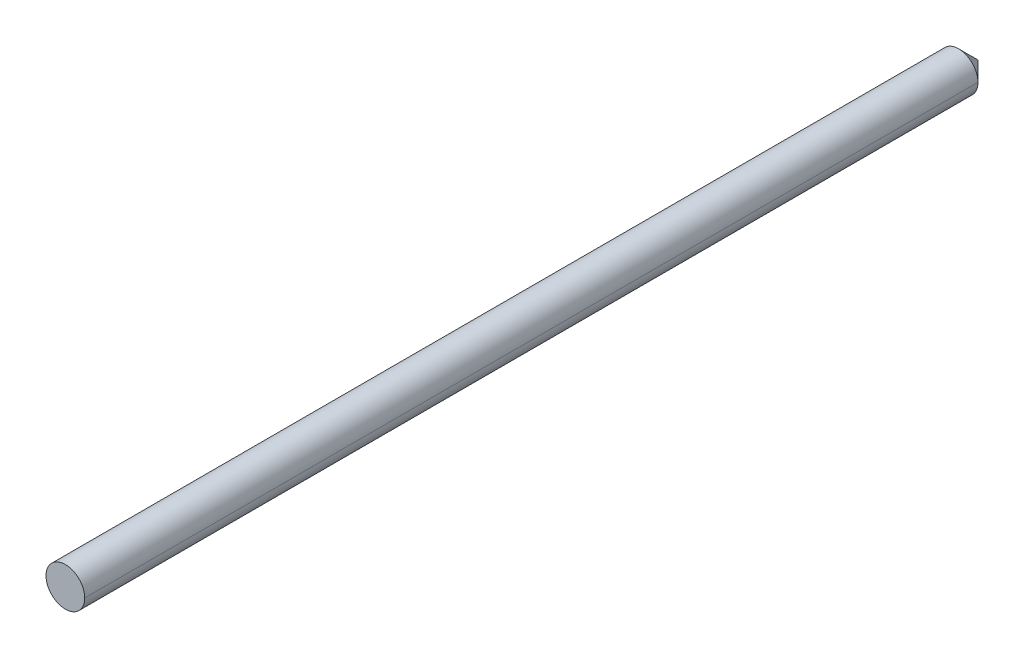
ISO-10303-21;
HEADER;
FILE_DESCRIPTION(('STEP AP214'),'2;1');
FILE_NAME('part.step','',(''),(''),'','','');
FILE_SCHEMA(('AUTOMOTIVE_DESIGN { 1 0 10303 214 1 1 1 1 }'));
ENDSEC;
DATA;
#1=APPLICATION_CONTEXT('core data for automotive mechanical design processes');
#2=APPLICATION_PROTOCOL_DEFINITION('international standard','automotive_design',2000,#1);
#3=PRODUCT_CONTEXT('',#1,'mechanical');
#4=PRODUCT('Part','Part','',(#3));
#5=PRODUCT_RELATED_PRODUCT_CATEGORY('part','',(#4));
#6=PRODUCT_DEFINITION_FORMATION('','',#4);
#7=PRODUCT_DEFINITION_CONTEXT('part definition',#1,'design');
#8=PRODUCT_DEFINITION('design','',#6,#7);
#9=PRODUCT_DEFINITION_SHAPE('','',#8);
#10=(LENGTH_UNIT() NAMED_UNIT(*) SI_UNIT(.MILLI.,.METRE.));
#11=(NAMED_UNIT(*) PLANE_ANGLE_UNIT() SI_UNIT($,.RADIAN.));
#12=(NAMED_UNIT(*) SI_UNIT($,.STERADIAN.) SOLID_ANGLE_UNIT());
#13=UNCERTAINTY_MEASURE_WITH_UNIT(LENGTH_MEASURE(1.E-05),#10,'distance_accuracy_value','');
#14=(GEOMETRIC_REPRESENTATION_CONTEXT(3) GLOBAL_UNCERTAINTY_ASSIGNED_CONTEXT((#13)) GLOBAL_UNIT_ASSIGNED_CONTEXT((#10,
#11,#12)) REPRESENTATION_CONTEXT('',''));
#15=CARTESIAN_POINT('',(0.,0.,0.));
#16=DIRECTION('',(0.,0.,1.));
#17=DIRECTION('',(1.,0.,0.));
#18=AXIS2_PLACEMENT_3D('',#15,#16,#17);
#19=CARTESIAN_POINT('',(4.45,2.08,-23.295));
#20=DIRECTION('',(0.,0.,-1.));
#21=DIRECTION('',(1.,0.,0.));
#22=AXIS2_PLACEMENT_3D('',#19,#20,#21);
#23=CYLINDRICAL_SURFACE('',#22,0.96);
#24=DIRECTION('',(0.,0.,-1.));
#25=VECTOR('',#24,1.);
#26=CARTESIAN_POINT('',(5.41,2.08,-23.295));
#27=LINE('',#26,#25);
#28=CARTESIAN_POINT('',(5.41,2.08,-1.155));
#29=VERTEX_POINT('',#28);
#30=CARTESIAN_POINT('',(5.41,2.08,-45.435));
#31=VERTEX_POINT('',#30);
#32=EDGE_CURVE('E71',#29,#31,#27,.T.);
#33=ORIENTED_EDGE('',*,*,#32,.T.);
#34=CARTESIAN_POINT('',(4.45,2.08,-45.435));
#35=DIRECTION('',(0.,0.,-1.));
#36=DIRECTION('',(1.,0.,0.));
#37=AXIS2_PLACEMENT_3D('',#34,#35,#36);
#38=CIRCLE('',#37,0.96);
#39=CARTESIAN_POINT('',(3.49,2.08,-45.435));
#40=VERTEX_POINT('',#39);
#41=EDGE_CURVE('E25',#40,#31,#38,.T.);
#42=ORIENTED_EDGE('',*,*,#41,.F.);
#43=DIRECTION('',(0.,0.,1.));
#44=VECTOR('',#43,1.);
#45=CARTESIAN_POINT('',(3.49,2.08,-23.295));
#46=LINE('',#45,#44);
#47=CARTESIAN_POINT('',(3.49,2.08,-1.155));
#48=VERTEX_POINT('',#47);
#49=EDGE_CURVE('E72',#40,#48,#46,.T.);
#50=ORIENTED_EDGE('',*,*,#49,.T.);
#51=CARTESIAN_POINT('',(4.45,2.08,-1.155));
#52=DIRECTION('',(0.,0.,1.));
#53=DIRECTION('',(1.,0.,0.));
#54=AXIS2_PLACEMENT_3D('',#51,#52,#53);
#55=CIRCLE('',#54,0.96);
#56=EDGE_CURVE('E11',#29,#48,#55,.T.);
#57=ORIENTED_EDGE('',*,*,#56,.F.);
#58=EDGE_LOOP('',(#33,#42,#50,#57));
#59=FACE_BOUND('',#58,.T.);
#60=ADVANCED_FACE('F17',(#59),#23,.T.);
#61=CARTESIAN_POINT('',(4.45,2.08,-1.155));
#62=DIRECTION('',(0.,0.,-1.));
#63=DIRECTION('',(0.,-1.,0.));
#64=AXIS2_PLACEMENT_3D('',#61,#62,#63);
#65=PLANE('',#64);
#66=ORIENTED_EDGE('',*,*,#56,.T.);
#67=CARTESIAN_POINT('',(4.45,2.08,-1.155));
#68=DIRECTION('',(0.,0.,1.));
#69=DIRECTION('',(1.,0.,0.));
#70=AXIS2_PLACEMENT_3D('',#67,#68,#69);
#71=CIRCLE('',#70,0.96);
#72=EDGE_CURVE('E77',#48,#29,#71,.T.);
#73=ORIENTED_EDGE('',*,*,#72,.T.);
#74=EDGE_LOOP('',(#66,#73));
#75=FACE_BOUND('',#74,.T.);
#76=ADVANCED_FACE('F89',(#75),#65,.F.);
#77=CARTESIAN_POINT('',(4.45,2.08,-45.915));
#78=DIRECTION('',(0.,0.,1.));
#79=DIRECTION('',(1.,0.,0.));
#80=AXIS2_PLACEMENT_3D('',#77,#78,#79);
#81=CONICAL_SURFACE('',#80,0.48,0.785398163397448);
#82=DIRECTION('',(-0.707106781186548,0.,0.707106781186548));
#83=VECTOR('',#82,1.);
#84=CARTESIAN_POINT('',(3.97,2.08,-45.915));
#85=LINE('',#84,#83);
#86=CARTESIAN_POINT('',(4.45,2.08,-46.395));
#87=VERTEX_POINT('',#86);
#88=EDGE_CURVE('E57',#87,#40,#85,.T.);
#89=ORIENTED_EDGE('',*,*,#88,.T.);
#90=ORIENTED_EDGE('',*,*,#41,.T.);
#91=DIRECTION('',(-0.707106781186547,0.,-0.707106781186548));
#92=VECTOR('',#91,1.);
#93=CARTESIAN_POINT('',(4.93,2.08,-45.915));
#94=LINE('',#93,#92);
#95=EDGE_CURVE('E37',#31,#87,#94,.T.);
#96=ORIENTED_EDGE('',*,*,#95,.T.);
#97=EDGE_LOOP('',(#89,#90,#96));
#98=FACE_BOUND('',#97,.T.);
#99=ADVANCED_FACE('F56',(#98),#81,.T.);
#100=CARTESIAN_POINT('',(4.45,2.08,-45.915));
#101=DIRECTION('',(0.,0.,1.));
#102=DIRECTION('',(1.,0.,0.));
#103=AXIS2_PLACEMENT_3D('',#100,#101,#102);
#104=CONICAL_SURFACE('',#103,0.48,0.785398163397448);
#105=ORIENTED_EDGE('',*,*,#88,.F.);
#106=ORIENTED_EDGE('',*,*,#95,.F.);
#107=CARTESIAN_POINT('',(4.45,2.08,-45.435));
#108=DIRECTION('',(0.,0.,-1.));
#109=DIRECTION('',(1.,0.,0.));
#110=AXIS2_PLACEMENT_3D('',#107,#108,#109);
#111=CIRCLE('',#110,0.96);
#112=EDGE_CURVE('E63',#31,#40,#111,.T.);
#113=ORIENTED_EDGE('',*,*,#112,.T.);
#114=EDGE_LOOP('',(#105,#106,#113));
#115=FACE_BOUND('',#114,.T.);
#116=ADVANCED_FACE('F62',(#115),#104,.T.);
#117=CARTESIAN_POINT('',(4.45,2.08,-23.295));
#118=DIRECTION('',(0.,0.,-1.));
#119=DIRECTION('',(1.,0.,0.));
#120=AXIS2_PLACEMENT_3D('',#117,#118,#119);
#121=CYLINDRICAL_SURFACE('',#120,0.96);
#122=ORIENTED_EDGE('',*,*,#32,.F.);
#123=ORIENTED_EDGE('',*,*,#72,.F.);
#124=ORIENTED_EDGE('',*,*,#49,.F.);
#125=ORIENTED_EDGE('',*,*,#112,.F.);
#126=EDGE_LOOP('',(#122,#123,#124,#125));
#127=FACE_BOUND('',#126,.T.);
#128=ADVANCED_FACE('F69',(#127),#121,.T.);
#129=CLOSED_SHELL('',(#60,#76,#99,#116,#128));
#130=MANIFOLD_SOLID_BREP('B1',#129);
#131=ADVANCED_BREP_SHAPE_REPRESENTATION('',(#18,#130),#14);
#132=SHAPE_DEFINITION_REPRESENTATION(#9,#131);
ENDSEC;
END-ISO-10303-21;
